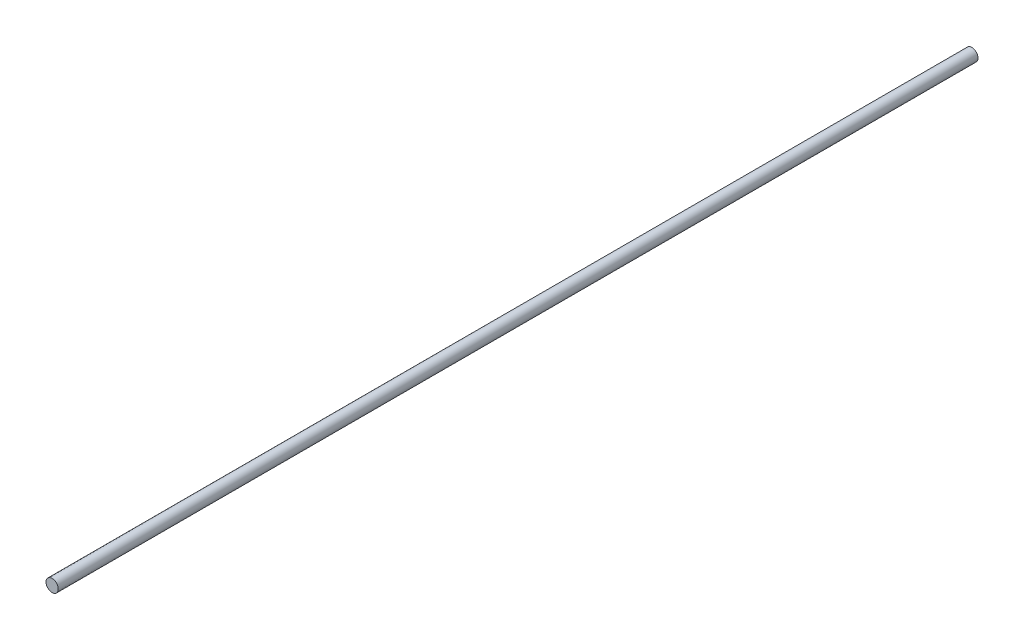
ISO-10303-21;
HEADER;
FILE_DESCRIPTION(('STEP AP214'),'2;1');
FILE_NAME('part.step','',(''),(''),'','','');
FILE_SCHEMA(('AUTOMOTIVE_DESIGN { 1 0 10303 214 1 1 1 1 }'));
ENDSEC;
DATA;
#1=APPLICATION_CONTEXT('core data for automotive mechanical design processes');
#2=APPLICATION_PROTOCOL_DEFINITION('international standard','automotive_design',2000,#1);
#3=PRODUCT_CONTEXT('',#1,'mechanical');
#4=PRODUCT('Part','Part','',(#3));
#5=PRODUCT_RELATED_PRODUCT_CATEGORY('part','',(#4));
#6=PRODUCT_DEFINITION_FORMATION('','',#4);
#7=PRODUCT_DEFINITION_CONTEXT('part definition',#1,'design');
#8=PRODUCT_DEFINITION('design','',#6,#7);
#9=PRODUCT_DEFINITION_SHAPE('','',#8);
#10=(LENGTH_UNIT() NAMED_UNIT(*) SI_UNIT(.MILLI.,.METRE.));
#11=(NAMED_UNIT(*) PLANE_ANGLE_UNIT() SI_UNIT($,.RADIAN.));
#12=(NAMED_UNIT(*) SI_UNIT($,.STERADIAN.) SOLID_ANGLE_UNIT());
#13=UNCERTAINTY_MEASURE_WITH_UNIT(LENGTH_MEASURE(1.E-05),#10,'distance_accuracy_value','');
#14=(GEOMETRIC_REPRESENTATION_CONTEXT(3) GLOBAL_UNCERTAINTY_ASSIGNED_CONTEXT((#13)) GLOBAL_UNIT_ASSIGNED_CONTEXT((#10,
#11,#12)) REPRESENTATION_CONTEXT('',''));
#15=CARTESIAN_POINT('',(0.,0.,0.));
#16=DIRECTION('',(0.,0.,1.));
#17=DIRECTION('',(1.,0.,0.));
#18=AXIS2_PLACEMENT_3D('',#15,#16,#17);
#19=CARTESIAN_POINT('',(0.,0.,300.));
#20=DIRECTION('',(0.,0.,-1.));
#21=DIRECTION('',(-1.,0.,0.));
#22=AXIS2_PLACEMENT_3D('',#19,#20,#21);
#23=CYLINDRICAL_SURFACE('',#22,2.);
#24=CARTESIAN_POINT('',(0.,0.,300.));
#25=DIRECTION('',(0.,0.,1.));
#26=DIRECTION('',(1.,0.,0.));
#27=AXIS2_PLACEMENT_3D('',#24,#25,#26);
#28=CIRCLE('',#27,2.);
#29=CARTESIAN_POINT('',(2.,0.,300.));
#30=VERTEX_POINT('',#29);
#31=EDGE_CURVE('E10',#30,#30,#28,.T.);
#32=ORIENTED_EDGE('',*,*,#31,.F.);
#33=EDGE_LOOP('',(#32));
#34=FACE_BOUND('',#33,.T.);
#35=CARTESIAN_POINT('',(0.,0.,0.));
#36=DIRECTION('',(0.,0.,1.));
#37=DIRECTION('',(1.,0.,0.));
#38=AXIS2_PLACEMENT_3D('',#35,#36,#37);
#39=CIRCLE('',#38,2.);
#40=CARTESIAN_POINT('',(2.,0.,0.));
#41=VERTEX_POINT('',#40);
#42=EDGE_CURVE('E34',#41,#41,#39,.T.);
#43=ORIENTED_EDGE('',*,*,#42,.T.);
#44=EDGE_LOOP('',(#43));
#45=FACE_BOUND('',#44,.T.);
#46=ADVANCED_FACE('F31',(#34,#45),#23,.T.);
#47=CARTESIAN_POINT('',(0.,0.,300.));
#48=DIRECTION('',(0.,0.,1.));
#49=DIRECTION('',(1.,0.,0.));
#50=AXIS2_PLACEMENT_3D('',#47,#48,#49);
#51=PLANE('',#50);
#52=ORIENTED_EDGE('',*,*,#31,.T.);
#53=EDGE_LOOP('',(#52));
#54=FACE_BOUND('',#53,.T.);
#55=ADVANCED_FACE('F46',(#54),#51,.T.);
#56=CARTESIAN_POINT('',(0.,0.,0.));
#57=DIRECTION('',(0.,0.,1.));
#58=DIRECTION('',(1.,0.,0.));
#59=AXIS2_PLACEMENT_3D('',#56,#57,#58);
#60=PLANE('',#59);
#61=ORIENTED_EDGE('',*,*,#42,.F.);
#62=EDGE_LOOP('',(#61));
#63=FACE_BOUND('',#62,.T.);
#64=ADVANCED_FACE('F44',(#63),#60,.F.);
#65=CLOSED_SHELL('',(#46,#55,#64));
#66=MANIFOLD_SOLID_BREP('B2',#65);
#67=ADVANCED_BREP_SHAPE_REPRESENTATION('',(#18,#66),#14);
#68=SHAPE_DEFINITION_REPRESENTATION(#9,#67);
ENDSEC;
END-ISO-10303-21;
